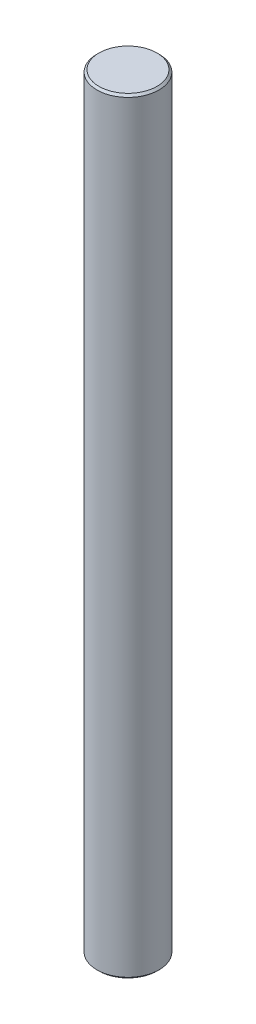
ISO-10303-21;
HEADER;
FILE_DESCRIPTION(('STEP AP214'),'2;1');
FILE_NAME('part.step','',(''),(''),'','','');
FILE_SCHEMA(('AUTOMOTIVE_DESIGN { 1 0 10303 214 1 1 1 1 }'));
ENDSEC;
DATA;
#1=APPLICATION_CONTEXT('core data for automotive mechanical design processes');
#2=APPLICATION_PROTOCOL_DEFINITION('international standard','automotive_design',2000,#1);
#3=PRODUCT_CONTEXT('',#1,'mechanical');
#4=PRODUCT('Part','Part','',(#3));
#5=PRODUCT_RELATED_PRODUCT_CATEGORY('part','',(#4));
#6=PRODUCT_DEFINITION_FORMATION('','',#4);
#7=PRODUCT_DEFINITION_CONTEXT('part definition',#1,'design');
#8=PRODUCT_DEFINITION('design','',#6,#7);
#9=PRODUCT_DEFINITION_SHAPE('','',#8);
#10=(LENGTH_UNIT() NAMED_UNIT(*) SI_UNIT(.MILLI.,.METRE.));
#11=(NAMED_UNIT(*) PLANE_ANGLE_UNIT() SI_UNIT($,.RADIAN.));
#12=(NAMED_UNIT(*) SI_UNIT($,.STERADIAN.) SOLID_ANGLE_UNIT());
#13=UNCERTAINTY_MEASURE_WITH_UNIT(LENGTH_MEASURE(1.E-05),#10,'distance_accuracy_value','');
#14=(GEOMETRIC_REPRESENTATION_CONTEXT(3) GLOBAL_UNCERTAINTY_ASSIGNED_CONTEXT((#13)) GLOBAL_UNIT_ASSIGNED_CONTEXT((#10,
#11,#12)) REPRESENTATION_CONTEXT('',''));
#15=CARTESIAN_POINT('',(0.,0.,0.));
#16=DIRECTION('',(0.,0.,1.));
#17=DIRECTION('',(1.,0.,0.));
#18=AXIS2_PLACEMENT_3D('',#15,#16,#17);
#19=CARTESIAN_POINT('',(0.,37.,0.));
#20=DIRECTION('',(0.,-1.,0.));
#21=DIRECTION('',(0.,0.,-1.));
#22=AXIS2_PLACEMENT_3D('',#19,#20,#21);
#23=CYLINDRICAL_SURFACE('',#22,1.5);
#24=CARTESIAN_POINT('',(0.,0.0999999999999959,0.));
#25=DIRECTION('',(0.,1.,0.));
#26=DIRECTION('',(0.,0.,1.));
#27=AXIS2_PLACEMENT_3D('',#24,#25,#26);
#28=CIRCLE('',#27,1.5);
#29=CARTESIAN_POINT('',(0.,0.0999999999999959,1.5));
#30=VERTEX_POINT('',#29);
#31=EDGE_CURVE('E42',#30,#30,#28,.T.);
#32=ORIENTED_EDGE('',*,*,#31,.T.);
#33=EDGE_LOOP('',(#32));
#34=FACE_BOUND('',#33,.T.);
#35=CARTESIAN_POINT('',(0.,36.9,0.));
#36=DIRECTION('',(0.,1.,0.));
#37=DIRECTION('',(0.,0.,1.));
#38=AXIS2_PLACEMENT_3D('',#35,#36,#37);
#39=CIRCLE('',#38,1.5);
#40=CARTESIAN_POINT('',(0.,36.9,1.5));
#41=VERTEX_POINT('',#40);
#42=EDGE_CURVE('E46',#41,#41,#39,.F.);
#43=ORIENTED_EDGE('',*,*,#42,.T.);
#44=EDGE_LOOP('',(#43));
#45=FACE_BOUND('',#44,.T.);
#46=ADVANCED_FACE('F31',(#34,#45),#23,.T.);
#47=CARTESIAN_POINT('',(0.,37.,0.));
#48=DIRECTION('',(0.,1.,0.));
#49=DIRECTION('',(0.,0.,1.));
#50=AXIS2_PLACEMENT_3D('',#47,#48,#49);
#51=PLANE('',#50);
#52=CARTESIAN_POINT('',(0.,37.,0.));
#53=DIRECTION('',(0.,1.,0.));
#54=DIRECTION('',(0.,0.,1.));
#55=AXIS2_PLACEMENT_3D('',#52,#53,#54);
#56=CIRCLE('',#55,1.39999999999999);
#57=CARTESIAN_POINT('',(0.,37.,1.39999999999999));
#58=VERTEX_POINT('',#57);
#59=EDGE_CURVE('E10',#58,#58,#56,.T.);
#60=ORIENTED_EDGE('',*,*,#59,.T.);
#61=EDGE_LOOP('',(#60));
#62=FACE_BOUND('',#61,.T.);
#63=ADVANCED_FACE('F62',(#62),#51,.T.);
#64=CARTESIAN_POINT('',(0.,0.,0.));
#65=DIRECTION('',(0.,1.,0.));
#66=DIRECTION('',(0.,0.,1.));
#67=AXIS2_PLACEMENT_3D('',#64,#65,#66);
#68=PLANE('',#67);
#69=CARTESIAN_POINT('',(0.,0.,0.));
#70=DIRECTION('',(0.,1.,0.));
#71=DIRECTION('',(0.,0.,1.));
#72=AXIS2_PLACEMENT_3D('',#69,#70,#71);
#73=CIRCLE('',#72,1.4);
#74=CARTESIAN_POINT('',(0.,0.,1.4));
#75=VERTEX_POINT('',#74);
#76=EDGE_CURVE('E38',#75,#75,#73,.F.);
#77=ORIENTED_EDGE('',*,*,#76,.T.);
#78=EDGE_LOOP('',(#77));
#79=FACE_BOUND('',#78,.T.);
#80=ADVANCED_FACE('F59',(#79),#68,.F.);
#81=CARTESIAN_POINT('',(0.,0.0999999999999959,0.));
#82=DIRECTION('',(0.,1.,0.));
#83=DIRECTION('',(0.,0.,1.));
#84=AXIS2_PLACEMENT_3D('',#81,#82,#83);
#85=CONICAL_SURFACE('',#84,1.5,0.785398163397457);
#86=ORIENTED_EDGE('',*,*,#76,.F.);
#87=EDGE_LOOP('',(#86));
#88=FACE_BOUND('',#87,.T.);
#89=ORIENTED_EDGE('',*,*,#31,.F.);
#90=EDGE_LOOP('',(#89));
#91=FACE_BOUND('',#90,.T.);
#92=ADVANCED_FACE('F55',(#88,#91),#85,.T.);
#93=CARTESIAN_POINT('',(0.,37.,0.));
#94=DIRECTION('',(0.,-1.,0.));
#95=DIRECTION('',(0.,0.,-1.));
#96=AXIS2_PLACEMENT_3D('',#93,#94,#95);
#97=CONICAL_SURFACE('',#96,1.39999999999999,0.785398163397388);
#98=ORIENTED_EDGE('',*,*,#42,.F.);
#99=EDGE_LOOP('',(#98));
#100=FACE_BOUND('',#99,.T.);
#101=ORIENTED_EDGE('',*,*,#59,.F.);
#102=EDGE_LOOP('',(#101));
#103=FACE_BOUND('',#102,.T.);
#104=ADVANCED_FACE('F33',(#100,#103),#97,.T.);
#105=CLOSED_SHELL('',(#46,#63,#80,#92,#104));
#106=MANIFOLD_SOLID_BREP('B2',#105);
#107=ADVANCED_BREP_SHAPE_REPRESENTATION('',(#18,#106),#14);
#108=SHAPE_DEFINITION_REPRESENTATION(#9,#107);
ENDSEC;
END-ISO-10303-21;
